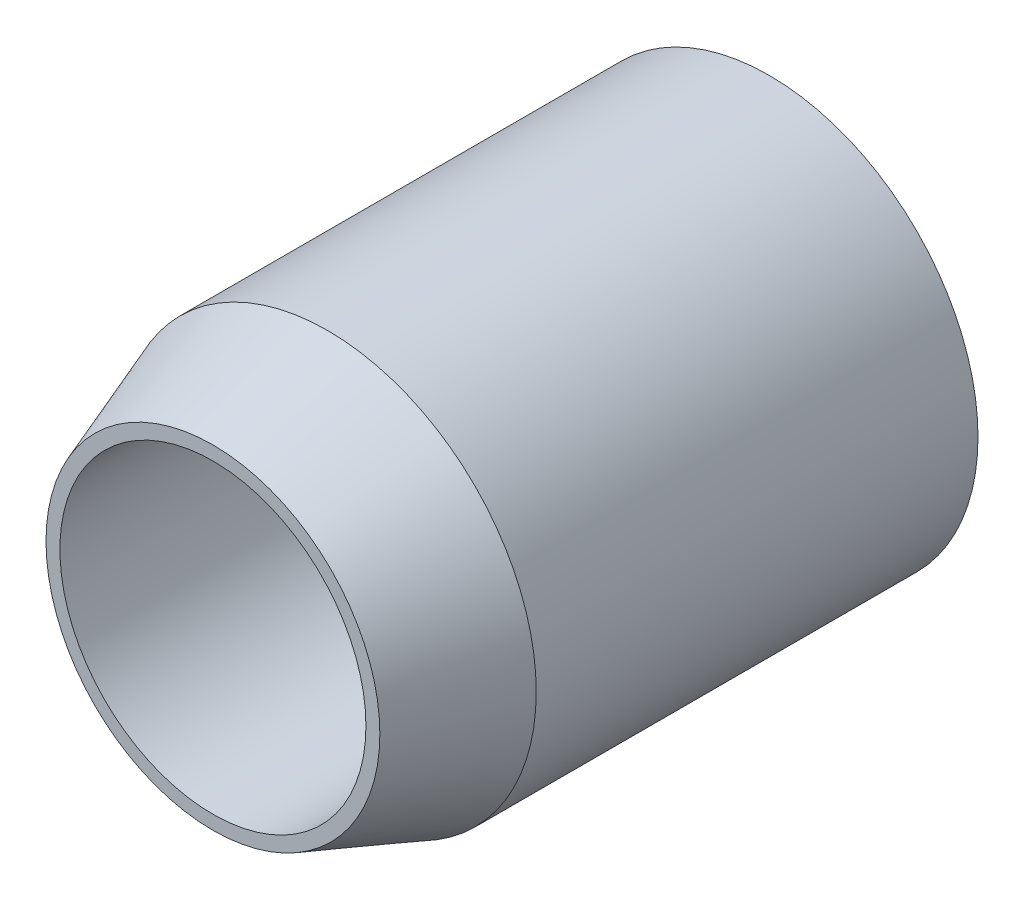
ISO-10303-21;
HEADER;
FILE_DESCRIPTION(('STEP AP214'),'2;1');
FILE_NAME('part.step','',(''),(''),'','','');
FILE_SCHEMA(('AUTOMOTIVE_DESIGN { 1 0 10303 214 1 1 1 1 }'));
ENDSEC;
DATA;
#1=APPLICATION_CONTEXT('core data for automotive mechanical design processes');
#2=APPLICATION_PROTOCOL_DEFINITION('international standard','automotive_design',2000,#1);
#3=PRODUCT_CONTEXT('',#1,'mechanical');
#4=PRODUCT('Part','Part','',(#3));
#5=PRODUCT_RELATED_PRODUCT_CATEGORY('part','',(#4));
#6=PRODUCT_DEFINITION_FORMATION('','',#4);
#7=PRODUCT_DEFINITION_CONTEXT('part definition',#1,'design');
#8=PRODUCT_DEFINITION('design','',#6,#7);
#9=PRODUCT_DEFINITION_SHAPE('','',#8);
#10=(LENGTH_UNIT() NAMED_UNIT(*) SI_UNIT(.MILLI.,.METRE.));
#11=(NAMED_UNIT(*) PLANE_ANGLE_UNIT() SI_UNIT($,.RADIAN.));
#12=(NAMED_UNIT(*) SI_UNIT($,.STERADIAN.) SOLID_ANGLE_UNIT());
#13=UNCERTAINTY_MEASURE_WITH_UNIT(LENGTH_MEASURE(1.E-05),#10,'distance_accuracy_value','');
#14=(GEOMETRIC_REPRESENTATION_CONTEXT(3) GLOBAL_UNCERTAINTY_ASSIGNED_CONTEXT((#13)) GLOBAL_UNIT_ASSIGNED_CONTEXT((#10,
#11,#12)) REPRESENTATION_CONTEXT('',''));
#15=CARTESIAN_POINT('',(0.,0.,0.));
#16=DIRECTION('',(0.,0.,1.));
#17=DIRECTION('',(1.,0.,0.));
#18=AXIS2_PLACEMENT_3D('',#15,#16,#17);
#19=CARTESIAN_POINT('',(0.,0.,20.));
#20=DIRECTION('',(0.,0.,-1.));
#21=DIRECTION('',(-1.,0.,0.));
#22=AXIS2_PLACEMENT_3D('',#19,#20,#21);
#23=CYLINDRICAL_SURFACE('',#22,7.5);
#24=CARTESIAN_POINT('',(0.,0.,15.8787838708181));
#25=DIRECTION('',(0.,0.,1.));
#26=DIRECTION('',(1.,0.,0.));
#27=AXIS2_PLACEMENT_3D('',#24,#25,#26);
#28=CIRCLE('',#27,7.5);
#29=CARTESIAN_POINT('',(7.5,0.,15.8787838708181));
#30=VERTEX_POINT('',#29);
#31=EDGE_CURVE('E10',#30,#30,#28,.F.);
#32=ORIENTED_EDGE('',*,*,#31,.T.);
#33=EDGE_LOOP('',(#32));
#34=FACE_BOUND('',#33,.T.);
#35=CARTESIAN_POINT('',(0.,0.,0.));
#36=DIRECTION('',(0.,0.,1.));
#37=DIRECTION('',(1.,0.,0.));
#38=AXIS2_PLACEMENT_3D('',#35,#36,#37);
#39=CIRCLE('',#38,7.5);
#40=CARTESIAN_POINT('',(7.5,0.,0.));
#41=VERTEX_POINT('',#40);
#42=EDGE_CURVE('E50',#41,#41,#39,.T.);
#43=ORIENTED_EDGE('',*,*,#42,.T.);
#44=EDGE_LOOP('',(#43));
#45=FACE_BOUND('',#44,.T.);
#46=ADVANCED_FACE('F37',(#34,#45),#23,.T.);
#47=CARTESIAN_POINT('',(0.,0.,20.));
#48=DIRECTION('',(0.,0.,1.));
#49=DIRECTION('',(1.,0.,0.));
#50=AXIS2_PLACEMENT_3D('',#47,#48,#49);
#51=PLANE('',#50);
#52=CARTESIAN_POINT('',(0.,0.,20.));
#53=DIRECTION('',(0.,0.,1.));
#54=DIRECTION('',(1.,0.,0.));
#55=AXIS2_PLACEMENT_3D('',#52,#53,#54);
#56=CIRCLE('',#55,6.);
#57=CARTESIAN_POINT('',(6.,0.,20.));
#58=VERTEX_POINT('',#57);
#59=EDGE_CURVE('E46',#58,#58,#56,.T.);
#60=ORIENTED_EDGE('',*,*,#59,.T.);
#61=EDGE_LOOP('',(#60));
#62=FACE_BOUND('',#61,.T.);
#63=CARTESIAN_POINT('',(0.,0.,20.));
#64=DIRECTION('',(0.,0.,1.));
#65=DIRECTION('',(1.,0.,0.));
#66=AXIS2_PLACEMENT_3D('',#63,#64,#65);
#67=CIRCLE('',#66,5.5);
#68=CARTESIAN_POINT('',(5.5,0.,20.));
#69=VERTEX_POINT('',#68);
#70=EDGE_CURVE('E56',#69,#69,#67,.T.);
#71=ORIENTED_EDGE('',*,*,#70,.F.);
#72=EDGE_LOOP('',(#71));
#73=FACE_BOUND('',#72,.T.);
#74=ADVANCED_FACE('F83',(#62,#73),#51,.T.);
#75=CARTESIAN_POINT('',(0.,0.,0.));
#76=DIRECTION('',(0.,0.,1.));
#77=DIRECTION('',(1.,0.,0.));
#78=AXIS2_PLACEMENT_3D('',#75,#76,#77);
#79=PLANE('',#78);
#80=CARTESIAN_POINT('',(0.,0.,0.));
#81=DIRECTION('',(0.,0.,-1.));
#82=DIRECTION('',(-1.,0.,0.));
#83=AXIS2_PLACEMENT_3D('',#80,#81,#82);
#84=CIRCLE('',#83,1.75);
#85=CARTESIAN_POINT('',(-1.75,0.,0.));
#86=VERTEX_POINT('',#85);
#87=EDGE_CURVE('E61',#86,#86,#84,.T.);
#88=ORIENTED_EDGE('',*,*,#87,.F.);
#89=EDGE_LOOP('',(#88));
#90=FACE_BOUND('',#89,.T.);
#91=ORIENTED_EDGE('',*,*,#42,.F.);
#92=EDGE_LOOP('',(#91));
#93=FACE_BOUND('',#92,.T.);
#94=ADVANCED_FACE('F79',(#90,#93),#79,.F.);
#95=CARTESIAN_POINT('',(0.,0.,10.));
#96=DIRECTION('',(0.,0.,1.));
#97=DIRECTION('',(1.,0.,0.));
#98=AXIS2_PLACEMENT_3D('',#95,#96,#97);
#99=CYLINDRICAL_SURFACE('',#98,5.5);
#100=CARTESIAN_POINT('',(0.,0.,10.));
#101=DIRECTION('',(0.,0.,1.));
#102=DIRECTION('',(1.,0.,0.));
#103=AXIS2_PLACEMENT_3D('',#100,#101,#102);
#104=CIRCLE('',#103,5.5);
#105=CARTESIAN_POINT('',(5.5,0.,10.));
#106=VERTEX_POINT('',#105);
#107=EDGE_CURVE('E55',#106,#106,#104,.T.);
#108=ORIENTED_EDGE('',*,*,#107,.F.);
#109=EDGE_LOOP('',(#108));
#110=FACE_BOUND('',#109,.T.);
#111=ORIENTED_EDGE('',*,*,#70,.T.);
#112=EDGE_LOOP('',(#111));
#113=FACE_BOUND('',#112,.T.);
#114=ADVANCED_FACE('F73',(#110,#113),#99,.F.);
#115=CARTESIAN_POINT('',(0.,0.,10.));
#116=DIRECTION('',(0.,0.,1.));
#117=DIRECTION('',(1.,0.,0.));
#118=AXIS2_PLACEMENT_3D('',#115,#116,#117);
#119=PLANE('',#118);
#120=CARTESIAN_POINT('',(0.,0.,10.));
#121=DIRECTION('',(0.,0.,1.));
#122=DIRECTION('',(1.,0.,0.));
#123=AXIS2_PLACEMENT_3D('',#120,#121,#122);
#124=CIRCLE('',#123,1.75);
#125=CARTESIAN_POINT('',(1.75,0.,10.));
#126=VERTEX_POINT('',#125);
#127=EDGE_CURVE('E42',#126,#126,#124,.T.);
#128=ORIENTED_EDGE('',*,*,#127,.F.);
#129=EDGE_LOOP('',(#128));
#130=FACE_BOUND('',#129,.T.);
#131=ORIENTED_EDGE('',*,*,#107,.T.);
#132=EDGE_LOOP('',(#131));
#133=FACE_BOUND('',#132,.T.);
#134=ADVANCED_FACE('F70',(#130,#133),#119,.T.);
#135=CARTESIAN_POINT('',(0.,0.,20.));
#136=DIRECTION('',(0.,0.,-1.));
#137=DIRECTION('',(-1.,0.,0.));
#138=AXIS2_PLACEMENT_3D('',#135,#136,#137);
#139=CONICAL_SURFACE('',#138,6.,0.349065850398868);
#140=ORIENTED_EDGE('',*,*,#31,.F.);
#141=EDGE_LOOP('',(#140));
#142=FACE_BOUND('',#141,.T.);
#143=ORIENTED_EDGE('',*,*,#59,.F.);
#144=EDGE_LOOP('',(#143));
#145=FACE_BOUND('',#144,.T.);
#146=ADVANCED_FACE('F40',(#142,#145),#139,.T.);
#147=CARTESIAN_POINT('',(0.,0.,20.));
#148=DIRECTION('',(0.,0.,-1.));
#149=DIRECTION('',(-1.,0.,0.));
#150=AXIS2_PLACEMENT_3D('',#147,#148,#149);
#151=CYLINDRICAL_SURFACE('',#150,1.75);
#152=ORIENTED_EDGE('',*,*,#127,.T.);
#153=EDGE_LOOP('',(#152));
#154=FACE_BOUND('',#153,.T.);
#155=ORIENTED_EDGE('',*,*,#87,.T.);
#156=EDGE_LOOP('',(#155));
#157=FACE_BOUND('',#156,.T.);
#158=ADVANCED_FACE('F68',(#154,#157),#151,.F.);
#159=CLOSED_SHELL('',(#46,#74,#94,#114,#134,#146,#158));
#160=MANIFOLD_SOLID_BREP('B2',#159);
#161=ADVANCED_BREP_SHAPE_REPRESENTATION('',(#18,#160),#14);
#162=SHAPE_DEFINITION_REPRESENTATION(#9,#161);
ENDSEC;
END-ISO-10303-21;
